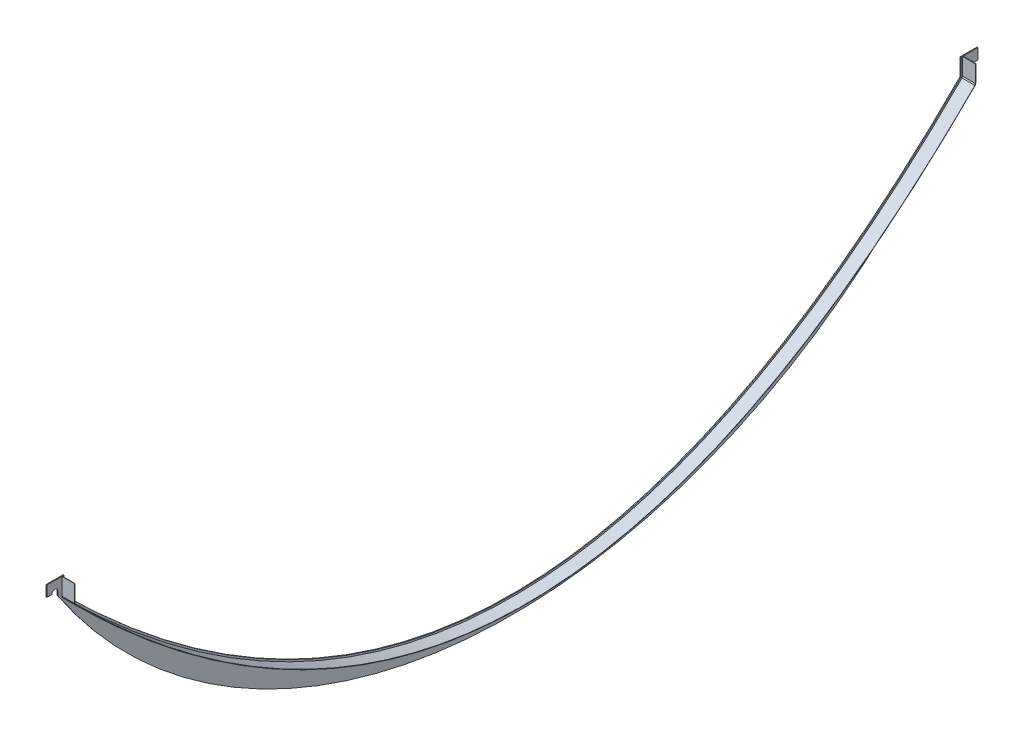
ISO-10303-21;
HEADER;
FILE_DESCRIPTION(('STEP AP214'),'2;1');
FILE_NAME('part.step','',(''),(''),'','','');
FILE_SCHEMA(('AUTOMOTIVE_DESIGN { 1 0 10303 214 1 1 1 1 }'));
ENDSEC;
DATA;
#1=APPLICATION_CONTEXT('core data for automotive mechanical design processes');
#2=APPLICATION_PROTOCOL_DEFINITION('international standard','automotive_design',2000,#1);
#3=PRODUCT_CONTEXT('',#1,'mechanical');
#4=PRODUCT('Part','Part','',(#3));
#5=PRODUCT_RELATED_PRODUCT_CATEGORY('part','',(#4));
#6=PRODUCT_DEFINITION_FORMATION('','',#4);
#7=PRODUCT_DEFINITION_CONTEXT('part definition',#1,'design');
#8=PRODUCT_DEFINITION('design','',#6,#7);
#9=PRODUCT_DEFINITION_SHAPE('','',#8);
#10=(LENGTH_UNIT() NAMED_UNIT(*) SI_UNIT(.MILLI.,.METRE.));
#11=(NAMED_UNIT(*) PLANE_ANGLE_UNIT() SI_UNIT($,.RADIAN.));
#12=(NAMED_UNIT(*) SI_UNIT($,.STERADIAN.) SOLID_ANGLE_UNIT());
#13=UNCERTAINTY_MEASURE_WITH_UNIT(LENGTH_MEASURE(1.E-05),#10,'distance_accuracy_value','');
#14=(GEOMETRIC_REPRESENTATION_CONTEXT(3) GLOBAL_UNCERTAINTY_ASSIGNED_CONTEXT((#13)) GLOBAL_UNIT_ASSIGNED_CONTEXT((#10,
#11,#12)) REPRESENTATION_CONTEXT('',''));
#15=CARTESIAN_POINT('',(0.,0.,0.));
#16=DIRECTION('',(0.,0.,1.));
#17=DIRECTION('',(1.,0.,0.));
#18=AXIS2_PLACEMENT_3D('',#15,#16,#17);
#19=CARTESIAN_POINT('',(2.54,-331.787529166974,-9.80548975348938E-10));
#20=DIRECTION('',(1.,0.,0.));
#21=DIRECTION('',(0.,0.,-1.));
#22=AXIS2_PLACEMENT_3D('',#19,#20,#21);
#23=PLANE('',#22);
#24=DIRECTION('',(0.,0.,1.));
#25=VECTOR('',#24,1.);
#26=CARTESIAN_POINT('',(2.54,382.587350832626,-1327.14999999998));
#27=LINE('',#26,#25);
#28=CARTESIAN_POINT('',(2.54,382.587350832626,-1377.95000240555));
#29=VERTEX_POINT('',#28);
#30=CARTESIAN_POINT('',(2.54,382.587350832626,-1333.49999999998));
#31=VERTEX_POINT('',#30);
#32=EDGE_CURVE('E162',#29,#31,#27,.T.);
#33=ORIENTED_EDGE('',*,*,#32,.T.);
#34=DIRECTION('',(0.,-1.,0.));
#35=VECTOR('',#34,1.);
#36=CARTESIAN_POINT('',(2.54,331.787470833133,-1333.49999999998));
#37=LINE('',#36,#35);
#38=CARTESIAN_POINT('',(2.54,331.787470833133,-1333.49999999998));
#39=VERTEX_POINT('',#38);
#40=EDGE_CURVE('E319',#31,#39,#37,.T.);
#41=ORIENTED_EDGE('',*,*,#40,.T.);
#42=DIRECTION('',(0.,-0.923879532475039,0.382683432452599));
#43=VECTOR('',#42,1.);
#44=CARTESIAN_POINT('',(2.54,327.297342772308,-1331.64012805989));
#45=LINE('',#44,#43);
#46=CARTESIAN_POINT('',(2.54,327.297342772308,-1331.64012805989));
#47=VERTEX_POINT('',#46);
#48=EDGE_CURVE('E316',#39,#47,#45,.T.);
#49=ORIENTED_EDGE('',*,*,#48,.T.);
#50=CARTESIAN_POINT('',(2.54000000000001,327.297342421288,1331.64012770984));
#51=CARTESIAN_POINT('',(2.54000000000001,216.514420462597,1220.8572057218));
#52=CARTESIAN_POINT('',(2.54000000000001,119.543483065854,1110.03926634494));
#53=CARTESIAN_POINT('',(2.54000000000001,-46.7566668610544,888.305733040598));
#54=CARTESIAN_POINT('',(2.54000000000001,-116.086154902246,777.389280230723));
#55=CARTESIAN_POINT('',(2.54000000000001,-227.060629021226,555.440331904742));
#56=CARTESIAN_POINT('',(2.54000000000001,-268.704746034081,444.40660332759));
#57=CARTESIAN_POINT('',(2.54000000000001,-324.244247161703,222.248598670373));
#58=CARTESIAN_POINT('',(2.54000000000001,-338.137529181646,111.124999809249));
#59=CARTESIAN_POINT('',(2.54000000000001,-338.137529152301,-111.125000161383));
#60=CARTESIAN_POINT('',(2.54000000000001,-324.244247103038,-222.248599022444));
#61=CARTESIAN_POINT('',(2.54000000000001,-268.704745916794,-444.406603679398));
#62=CARTESIAN_POINT('',(2.54000000000001,-227.06062887463,-555.440332256359));
#63=CARTESIAN_POINT('',(2.54000000000001,-116.086154697159,-777.389280581935));
#64=CARTESIAN_POINT('',(2.54000000000001,-46.7566666267703,-888.305733391594));
#65=CARTESIAN_POINT('',(2.54000000000001,119.54348335854,-1110.03926669548));
#66=CARTESIAN_POINT('',(2.54000000000001,216.514420784437,-1220.8572060721));
#67=CARTESIAN_POINT('',(2.54000000000001,327.29734277231,-1331.6401280599));
#68=B_SPLINE_CURVE_WITH_KNOTS('',3,(#50,#51,#52,#53,#54,#55,#56,#57,#58,#59,#60,#61,#62,#63,#64,
#65,#66,#67),.UNSPECIFIED.,.F.,.F.,(4,2,2,2,2,2,2,2,4),(0.,0.125,0.25,0.375,0.5,0.625,0.75,
0.875,1.),.UNSPECIFIED.);
#69=CARTESIAN_POINT('',(2.54,327.297342421288,1331.64012770984));
#70=VERTEX_POINT('',#69);
#71=EDGE_CURVE('E312',#47,#70,#68,.F.);
#72=ORIENTED_EDGE('',*,*,#71,.T.);
#73=DIRECTION('',(0.,0.923879517586631,0.382683468396395));
#74=VECTOR('',#73,1.);
#75=CARTESIAN_POINT('',(2.54,327.297342421288,1331.64012770984));
#76=LINE('',#75,#74);
#77=CARTESIAN_POINT('',(2.54,331.787470833133,1333.49999999998));
#78=VERTEX_POINT('',#77);
#79=EDGE_CURVE('E309',#70,#78,#76,.T.);
#80=ORIENTED_EDGE('',*,*,#79,.T.);
#81=DIRECTION('',(0.,1.,0.));
#82=VECTOR('',#81,1.);
#83=CARTESIAN_POINT('',(2.54,331.787470833133,1333.49999999998));
#84=LINE('',#83,#82);
#85=CARTESIAN_POINT('',(2.54,382.587350832634,1333.49999999998));
#86=VERTEX_POINT('',#85);
#87=EDGE_CURVE('E313',#78,#86,#84,.T.);
#88=ORIENTED_EDGE('',*,*,#87,.T.);
#89=DIRECTION('',(0.,-7.12465923009911E-13,1.));
#90=VECTOR('',#89,1.);
#91=CARTESIAN_POINT('',(2.54,382.587350832639,1327.15000000006));
#92=LINE('',#91,#90);
#93=CARTESIAN_POINT('',(2.54,382.587350832602,1377.95000240561));
#94=VERTEX_POINT('',#93);
#95=EDGE_CURVE('E192',#86,#94,#92,.T.);
#96=ORIENTED_EDGE('',*,*,#95,.T.);
#97=DIRECTION('',(0.,-1.,-7.04655444175812E-13));
#98=VECTOR('',#97,1.);
#99=CARTESIAN_POINT('',(2.54,382.587350832602,1377.95000240561));
#100=LINE('',#99,#98);
#101=CARTESIAN_POINT('',(2.54,350.761150832603,1377.95000240559));
#102=VERTEX_POINT('',#101);
#103=EDGE_CURVE('E264',#94,#102,#100,.T.);
#104=ORIENTED_EDGE('',*,*,#103,.T.);
#105=DIRECTION('',(0.,7.13625394007323E-13,-1.));
#106=VECTOR('',#105,1.);
#107=CARTESIAN_POINT('',(2.54,350.761150832603,1377.95000240559));
#108=LINE('',#107,#106);
#109=CARTESIAN_POINT('',(2.54,350.761150832613,1363.01479812907));
#110=VERTEX_POINT('',#109);
#111=EDGE_CURVE('E270',#102,#110,#108,.T.);
#112=ORIENTED_EDGE('',*,*,#111,.T.);
#113=CARTESIAN_POINT('',(2.54,350.761150832626,1354.04859906458));
#114=DIRECTION('',(-1.,0.,0.));
#115=DIRECTION('',(0.,0.,1.));
#116=AXIS2_PLACEMENT_3D('',#113,#114,#115);
#117=CIRCLE('',#116,8.96619906449081);
#118=CARTESIAN_POINT('',(2.54,350.761150832626,1345.0824000001));
#119=VERTEX_POINT('',#118);
#120=EDGE_CURVE('E272',#110,#119,#117,.T.);
#121=ORIENTED_EDGE('',*,*,#120,.T.);
#122=DIRECTION('',(0.,-1.,-7.26330521920819E-13));
#123=VECTOR('',#122,1.);
#124=CARTESIAN_POINT('',(2.54,350.761150832626,1345.0824000001));
#125=LINE('',#124,#123);
#126=CARTESIAN_POINT('',(2.54,338.838562794917,1345.08240000009));
#127=VERTEX_POINT('',#126);
#128=EDGE_CURVE('E274',#119,#127,#125,.T.);
#129=ORIENTED_EDGE('',*,*,#128,.T.);
#130=CARTESIAN_POINT('',(2.54,1232.06315709874,3.81723085261434E-10));
#131=DIRECTION('',(1.,0.,0.));
#132=DIRECTION('',(0.,0.,1.));
#133=AXIS2_PLACEMENT_3D('',#130,#131,#132);
#134=CIRCLE('',#133,1614.65068626568);
#135=CARTESIAN_POINT('',(2.54,338.838562795876,-1345.08239999997));
#136=VERTEX_POINT('',#135);
#137=EDGE_CURVE('E276',#127,#136,#134,.T.);
#138=ORIENTED_EDGE('',*,*,#137,.T.);
#139=DIRECTION('',(0.,1.,-6.61147013596444E-12));
#140=VECTOR('',#139,1.);
#141=CARTESIAN_POINT('',(2.54,350.761150832627,-1345.08240000004));
#142=LINE('',#141,#140);
#143=CARTESIAN_POINT('',(2.54,350.761150832627,-1345.08240000004));
#144=VERTEX_POINT('',#143);
#145=EDGE_CURVE('E278',#136,#144,#142,.T.);
#146=ORIENTED_EDGE('',*,*,#145,.T.);
#147=CARTESIAN_POINT('',(2.54,350.761150832627,-1354.04859906454));
#148=DIRECTION('',(-1.,0.,0.));
#149=DIRECTION('',(0.,0.,-1.));
#150=AXIS2_PLACEMENT_3D('',#147,#148,#149);
#151=CIRCLE('',#150,8.96619906449081);
#152=CARTESIAN_POINT('',(2.54,350.761150832627,-1363.01479812903));
#153=VERTEX_POINT('',#152);
#154=EDGE_CURVE('E280',#144,#153,#151,.T.);
#155=ORIENTED_EDGE('',*,*,#154,.T.);
#156=DIRECTION('',(0.,0.,-1.));
#157=VECTOR('',#156,1.);
#158=CARTESIAN_POINT('',(2.54,350.761150832627,-1377.95000240555));
#159=LINE('',#158,#157);
#160=CARTESIAN_POINT('',(2.54,350.761150832627,-1377.95000240555));
#161=VERTEX_POINT('',#160);
#162=EDGE_CURVE('E164',#153,#161,#159,.T.);
#163=ORIENTED_EDGE('',*,*,#162,.T.);
#164=DIRECTION('',(0.,1.,0.));
#165=VECTOR('',#164,1.);
#166=CARTESIAN_POINT('',(2.54,382.587350832626,-1377.95000240555));
#167=LINE('',#166,#165);
#168=EDGE_CURVE('E157',#161,#29,#167,.T.);
#169=ORIENTED_EDGE('',*,*,#168,.T.);
#170=EDGE_LOOP('',(#33,#41,#49,#72,#80,#88,#96,#104,#112,#121,#129,#138,#146,#155,#163,#169));
#171=FACE_BOUND('',#170,.T.);
#172=ADVANCED_FACE('F35',(#171),#23,.T.);
#173=CARTESIAN_POINT('',(2.54,999668.212470872,-51519.8990674703));
#174=CARTESIAN_POINT('',(2.54,-1000331.78752917,-7.55456142087496E-07));
#175=CARTESIAN_POINT('',(2.54,999668.212470794,51519.8990689773));
#176=B_SPLINE_CURVE_WITH_KNOTS('',2,(#173,#174,#175),.UNSPECIFIED.,.F.,.F.,(3,3),(0.,1.),.UNSPECIFIED.);
#177=DIRECTION('',(-1.,0.,0.));
#178=VECTOR('',#177,1.);
#179=SURFACE_OF_LINEAR_EXTRUSION('',#176,#178);
#180=CARTESIAN_POINT('',(0.,999668.212470872,-51519.8990674703));
#181=CARTESIAN_POINT('',(0.,-1000331.78752917,-7.55456142087496E-07));
#182=CARTESIAN_POINT('',(0.,999668.212470794,51519.8990689773));
#183=B_SPLINE_CURVE_WITH_KNOTS('',2,(#180,#181,#182),.UNSPECIFIED.,.F.,.F.,(3,3),(0.,1.),.UNSPECIFIED.);
#184=CARTESIAN_POINT('',(0.,331.787470833288,-1327.14999999977));
#185=VERTEX_POINT('',#184);
#186=CARTESIAN_POINT('',(0.,331.787470832646,1327.15000000013));
#187=VERTEX_POINT('',#186);
#188=EDGE_CURVE('E200',#185,#187,#183,.T.);
#189=ORIENTED_EDGE('',*,*,#188,.T.);
#190=DIRECTION('',(-1.,0.,0.));
#191=VECTOR('',#190,1.);
#192=CARTESIAN_POINT('',(2.54,331.787470832646,1327.15000000013));
#193=LINE('',#192,#191);
#194=CARTESIAN_POINT('',(2.54,331.787470832646,1327.15000000013));
#195=VERTEX_POINT('',#194);
#196=EDGE_CURVE('E11',#195,#187,#193,.T.);
#197=ORIENTED_EDGE('',*,*,#196,.F.);
#198=CARTESIAN_POINT('',(2.54,331.787470833288,-1327.14999999977));
#199=VERTEX_POINT('',#198);
#200=EDGE_CURVE('E233',#199,#195,#176,.T.);
#201=ORIENTED_EDGE('',*,*,#200,.F.);
#202=DIRECTION('',(-1.,0.,0.));
#203=VECTOR('',#202,1.);
#204=CARTESIAN_POINT('',(2.54,331.787470833288,-1327.14999999977));
#205=LINE('',#204,#203);
#206=EDGE_CURVE('E187',#199,#185,#205,.T.);
#207=ORIENTED_EDGE('',*,*,#206,.T.);
#208=EDGE_LOOP('',(#189,#197,#201,#207));
#209=FACE_BOUND('',#208,.T.);
#210=ADVANCED_FACE('F37',(#209),#179,.F.);
#211=CARTESIAN_POINT('',(2.54,331.787470832646,1327.15000000013));
#212=DIRECTION('',(0.,1.49487075332406E-12,1.));
#213=DIRECTION('',(0.,-1.,1.49487075332406E-12));
#214=AXIS2_PLACEMENT_3D('',#211,#212,#213);
#215=PLANE('',#214);
#216=DIRECTION('',(0.,1.,-1.49487075332406E-12));
#217=VECTOR('',#216,1.);
#218=CARTESIAN_POINT('',(0.,331.787470832646,1327.15000000013));
#219=LINE('',#218,#217);
#220=CARTESIAN_POINT('',(0.,382.587350832639,1327.15000000006));
#221=VERTEX_POINT('',#220);
#222=EDGE_CURVE('E205',#187,#221,#219,.T.);
#223=ORIENTED_EDGE('',*,*,#222,.T.);
#224=DIRECTION('',(-1.,0.,0.));
#225=VECTOR('',#224,1.);
#226=CARTESIAN_POINT('',(2.54,382.587350832639,1327.15000000006));
#227=LINE('',#226,#225);
#228=CARTESIAN_POINT('',(2.54,382.587350832639,1327.15000000006));
#229=VERTEX_POINT('',#228);
#230=EDGE_CURVE('E45',#229,#221,#227,.T.);
#231=ORIENTED_EDGE('',*,*,#230,.F.);
#232=DIRECTION('',(0.,1.,-1.49487075332406E-12));
#233=VECTOR('',#232,1.);
#234=CARTESIAN_POINT('',(2.54,331.787470832646,1327.15000000013));
#235=LINE('',#234,#233);
#236=EDGE_CURVE('E121',#195,#229,#235,.T.);
#237=ORIENTED_EDGE('',*,*,#236,.F.);
#238=ORIENTED_EDGE('',*,*,#196,.T.);
#239=EDGE_LOOP('',(#223,#231,#237,#238));
#240=FACE_BOUND('',#239,.T.);
#241=ADVANCED_FACE('F638',(#240),#215,.F.);
#242=CARTESIAN_POINT('',(2.54,382.587350832639,1327.15000000006));
#243=DIRECTION('',(0.,-1.,-7.12465923009911E-13));
#244=DIRECTION('',(0.,7.12465923009911E-13,-1.));
#245=AXIS2_PLACEMENT_3D('',#242,#243,#244);
#246=PLANE('',#245);
#247=DIRECTION('',(0.,-7.12465923009911E-13,1.));
#248=VECTOR('',#247,1.);
#249=CARTESIAN_POINT('',(0.,382.587350832639,1327.15000000006));
#250=LINE('',#249,#248);
#251=CARTESIAN_POINT('',(0.,382.587350832602,1377.95000240561));
#252=VERTEX_POINT('',#251);
#253=EDGE_CURVE('E211',#221,#252,#250,.T.);
#254=ORIENTED_EDGE('',*,*,#253,.T.);
#255=DIRECTION('',(-1.,0.,0.));
#256=VECTOR('',#255,1.);
#257=CARTESIAN_POINT('',(2.54,382.587350832602,1377.95000240561));
#258=LINE('',#257,#256);
#259=EDGE_CURVE('E258',#94,#252,#258,.T.);
#260=ORIENTED_EDGE('',*,*,#259,.F.);
#261=ORIENTED_EDGE('',*,*,#95,.F.);
#262=DIRECTION('',(-1.,0.,0.));
#263=VECTOR('',#262,1.);
#264=CARTESIAN_POINT('',(40.64,382.587350832626,1333.49999999998));
#265=LINE('',#264,#263);
#266=CARTESIAN_POINT('',(40.64,382.587350832626,1333.49999999998));
#267=VERTEX_POINT('',#266);
#268=EDGE_CURVE('E53',#267,#86,#265,.T.);
#269=ORIENTED_EDGE('',*,*,#268,.F.);
#270=DIRECTION('',(0.,0.,-1.));
#271=VECTOR('',#270,1.);
#272=CARTESIAN_POINT('',(40.64,382.587350832626,1333.49999999998));
#273=LINE('',#272,#271);
#274=CARTESIAN_POINT('',(40.64,382.587350832626,1332.22999999998));
#275=VERTEX_POINT('',#274);
#276=EDGE_CURVE('E530',#267,#275,#273,.T.);
#277=ORIENTED_EDGE('',*,*,#276,.T.);
#278=DIRECTION('',(-1.,0.,0.));
#279=VECTOR('',#278,1.);
#280=CARTESIAN_POINT('',(40.64,382.587350832626,1332.22999999998));
#281=LINE('',#280,#279);
#282=CARTESIAN_POINT('',(2.54,382.587350832626,1332.22999999998));
#283=VERTEX_POINT('',#282);
#284=EDGE_CURVE('E206',#275,#283,#281,.T.);
#285=ORIENTED_EDGE('',*,*,#284,.T.);
#286=EDGE_CURVE('E262',#229,#283,#92,.T.);
#287=ORIENTED_EDGE('',*,*,#286,.F.);
#288=ORIENTED_EDGE('',*,*,#230,.T.);
#289=EDGE_LOOP('',(#254,#260,#261,#269,#277,#285,#287,#288));
#290=FACE_BOUND('',#289,.T.);
#291=ADVANCED_FACE('F607',(#290),#246,.F.);
#292=CARTESIAN_POINT('',(2.54,382.587350832602,1377.95000240561));
#293=DIRECTION('',(0.,7.04655444175812E-13,-1.));
#294=DIRECTION('',(0.,1.,7.04655444175812E-13));
#295=AXIS2_PLACEMENT_3D('',#292,#293,#294);
#296=PLANE('',#295);
#297=DIRECTION('',(0.,-1.,-7.04655444175812E-13));
#298=VECTOR('',#297,1.);
#299=CARTESIAN_POINT('',(0.,382.587350832602,1377.95000240561));
#300=LINE('',#299,#298);
#301=CARTESIAN_POINT('',(0.,350.761150832603,1377.95000240559));
#302=VERTEX_POINT('',#301);
#303=EDGE_CURVE('E213',#252,#302,#300,.T.);
#304=ORIENTED_EDGE('',*,*,#303,.T.);
#305=DIRECTION('',(-1.,0.,0.));
#306=VECTOR('',#305,1.);
#307=CARTESIAN_POINT('',(2.54,350.761150832603,1377.95000240559));
#308=LINE('',#307,#306);
#309=EDGE_CURVE('E255',#102,#302,#308,.T.);
#310=ORIENTED_EDGE('',*,*,#309,.F.);
#311=ORIENTED_EDGE('',*,*,#103,.F.);
#312=ORIENTED_EDGE('',*,*,#259,.T.);
#313=EDGE_LOOP('',(#304,#310,#311,#312));
#314=FACE_BOUND('',#313,.T.);
#315=ADVANCED_FACE('F614',(#314),#296,.F.);
#316=CARTESIAN_POINT('',(2.54,350.761150832603,1377.95000240559));
#317=DIRECTION('',(0.,1.,7.13625394007323E-13));
#318=DIRECTION('',(0.,-7.13625394007323E-13,1.));
#319=AXIS2_PLACEMENT_3D('',#316,#317,#318);
#320=PLANE('',#319);
#321=DIRECTION('',(0.,7.13625394007323E-13,-1.));
#322=VECTOR('',#321,1.);
#323=CARTESIAN_POINT('',(0.,350.761150832603,1377.95000240559));
#324=LINE('',#323,#322);
#325=CARTESIAN_POINT('',(0.,350.761150832613,1363.01479812907));
#326=VERTEX_POINT('',#325);
#327=EDGE_CURVE('E215',#302,#326,#324,.T.);
#328=ORIENTED_EDGE('',*,*,#327,.T.);
#329=DIRECTION('',(-1.,0.,0.));
#330=VECTOR('',#329,1.);
#331=CARTESIAN_POINT('',(2.54,350.761150832613,1363.01479812907));
#332=LINE('',#331,#330);
#333=EDGE_CURVE('E252',#110,#326,#332,.T.);
#334=ORIENTED_EDGE('',*,*,#333,.F.);
#335=ORIENTED_EDGE('',*,*,#111,.F.);
#336=ORIENTED_EDGE('',*,*,#309,.T.);
#337=EDGE_LOOP('',(#328,#334,#335,#336));
#338=FACE_BOUND('',#337,.T.);
#339=ADVANCED_FACE('F618',(#338),#320,.F.);
#340=CARTESIAN_POINT('',(2.54,350.761150832626,1354.04859906458));
#341=DIRECTION('',(-1.,0.,0.));
#342=DIRECTION('',(0.,0.,1.));
#343=AXIS2_PLACEMENT_3D('',#340,#341,#342);
#344=CYLINDRICAL_SURFACE('',#343,8.96619906449081);
#345=CARTESIAN_POINT('',(0.,350.761150832626,1354.04859906458));
#346=DIRECTION('',(-1.,0.,0.));
#347=DIRECTION('',(0.,0.,1.));
#348=AXIS2_PLACEMENT_3D('',#345,#346,#347);
#349=CIRCLE('',#348,8.96619906449081);
#350=CARTESIAN_POINT('',(0.,350.761150832626,1345.0824000001));
#351=VERTEX_POINT('',#350);
#352=EDGE_CURVE('E217',#326,#351,#349,.T.);
#353=ORIENTED_EDGE('',*,*,#352,.T.);
#354=DIRECTION('',(-1.,0.,0.));
#355=VECTOR('',#354,1.);
#356=CARTESIAN_POINT('',(2.54,350.761150832626,1345.0824000001));
#357=LINE('',#356,#355);
#358=EDGE_CURVE('E249',#119,#351,#357,.T.);
#359=ORIENTED_EDGE('',*,*,#358,.F.);
#360=ORIENTED_EDGE('',*,*,#120,.F.);
#361=ORIENTED_EDGE('',*,*,#333,.T.);
#362=EDGE_LOOP('',(#353,#359,#360,#361));
#363=FACE_BOUND('',#362,.T.);
#364=ADVANCED_FACE('F623',(#363),#344,.F.);
#365=CARTESIAN_POINT('',(2.54,350.761150832626,1345.0824000001));
#366=DIRECTION('',(0.,7.26330521920819E-13,-1.));
#367=DIRECTION('',(0.,1.,7.26330521920819E-13));
#368=AXIS2_PLACEMENT_3D('',#365,#366,#367);
#369=PLANE('',#368);
#370=DIRECTION('',(0.,-1.,-7.26330521920819E-13));
#371=VECTOR('',#370,1.);
#372=CARTESIAN_POINT('',(0.,350.761150832626,1345.0824000001));
#373=LINE('',#372,#371);
#374=CARTESIAN_POINT('',(0.,338.838562794917,1345.08240000009));
#375=VERTEX_POINT('',#374);
#376=EDGE_CURVE('E219',#351,#375,#373,.T.);
#377=ORIENTED_EDGE('',*,*,#376,.T.);
#378=DIRECTION('',(-1.,0.,0.));
#379=VECTOR('',#378,1.);
#380=CARTESIAN_POINT('',(2.54,338.838562794917,1345.08240000009));
#381=LINE('',#380,#379);
#382=EDGE_CURVE('E246',#127,#375,#381,.T.);
#383=ORIENTED_EDGE('',*,*,#382,.F.);
#384=ORIENTED_EDGE('',*,*,#128,.F.);
#385=ORIENTED_EDGE('',*,*,#358,.T.);
#386=EDGE_LOOP('',(#377,#383,#384,#385));
#387=FACE_BOUND('',#386,.T.);
#388=ADVANCED_FACE('F629',(#387),#369,.F.);
#389=CARTESIAN_POINT('',(2.54,1232.06315709874,3.81723085261434E-10));
#390=DIRECTION('',(-1.,0.,0.));
#391=DIRECTION('',(0.,0.,1.));
#392=AXIS2_PLACEMENT_3D('',#389,#390,#391);
#393=CYLINDRICAL_SURFACE('',#392,1614.65068626568);
#394=CARTESIAN_POINT('',(0.,1232.06315709874,3.81723085261434E-10));
#395=DIRECTION('',(1.,0.,0.));
#396=DIRECTION('',(0.,0.,1.));
#397=AXIS2_PLACEMENT_3D('',#394,#395,#396);
#398=CIRCLE('',#397,1614.65068626568);
#399=CARTESIAN_POINT('',(0.,338.838562795876,-1345.08239999997));
#400=VERTEX_POINT('',#399);
#401=EDGE_CURVE('E221',#375,#400,#398,.T.);
#402=ORIENTED_EDGE('',*,*,#401,.T.);
#403=DIRECTION('',(-1.,0.,0.));
#404=VECTOR('',#403,1.);
#405=CARTESIAN_POINT('',(2.54,338.838562795876,-1345.08239999997));
#406=LINE('',#405,#404);
#407=EDGE_CURVE('E243',#136,#400,#406,.T.);
#408=ORIENTED_EDGE('',*,*,#407,.F.);
#409=ORIENTED_EDGE('',*,*,#137,.F.);
#410=ORIENTED_EDGE('',*,*,#382,.T.);
#411=EDGE_LOOP('',(#402,#408,#409,#410));
#412=FACE_BOUND('',#411,.T.);
#413=ADVANCED_FACE('F633',(#412),#393,.T.);
#414=CARTESIAN_POINT('',(2.54,350.761150832627,-1345.08240000004));
#415=DIRECTION('',(0.,6.61147013596444E-12,1.));
#416=DIRECTION('',(0.,-1.,6.61147013596444E-12));
#417=AXIS2_PLACEMENT_3D('',#414,#415,#416);
#418=PLANE('',#417);
#419=DIRECTION('',(0.,1.,-6.61147013596444E-12));
#420=VECTOR('',#419,1.);
#421=CARTESIAN_POINT('',(0.,350.761150832627,-1345.08240000004));
#422=LINE('',#421,#420);
#423=CARTESIAN_POINT('',(0.,350.761150832627,-1345.08240000004));
#424=VERTEX_POINT('',#423);
#425=EDGE_CURVE('E223',#400,#424,#422,.T.);
#426=ORIENTED_EDGE('',*,*,#425,.T.);
#427=DIRECTION('',(-1.,0.,0.));
#428=VECTOR('',#427,1.);
#429=CARTESIAN_POINT('',(2.54,350.761150832627,-1345.08240000004));
#430=LINE('',#429,#428);
#431=EDGE_CURVE('E240',#144,#424,#430,.T.);
#432=ORIENTED_EDGE('',*,*,#431,.F.);
#433=ORIENTED_EDGE('',*,*,#145,.F.);
#434=ORIENTED_EDGE('',*,*,#407,.T.);
#435=EDGE_LOOP('',(#426,#432,#433,#434));
#436=FACE_BOUND('',#435,.T.);
#437=ADVANCED_FACE('F636',(#436),#418,.F.);
#438=CARTESIAN_POINT('',(2.54,350.761150832627,-1354.04859906454));
#439=DIRECTION('',(-1.,0.,0.));
#440=DIRECTION('',(0.,0.,1.));
#441=AXIS2_PLACEMENT_3D('',#438,#439,#440);
#442=CYLINDRICAL_SURFACE('',#441,8.96619906449081);
#443=CARTESIAN_POINT('',(0.,350.761150832627,-1354.04859906454));
#444=DIRECTION('',(-1.,0.,0.));
#445=DIRECTION('',(0.,0.,-1.));
#446=AXIS2_PLACEMENT_3D('',#443,#444,#445);
#447=CIRCLE('',#446,8.96619906449081);
#448=CARTESIAN_POINT('',(0.,350.761150832627,-1363.01479812903));
#449=VERTEX_POINT('',#448);
#450=EDGE_CURVE('E225',#424,#449,#447,.T.);
#451=ORIENTED_EDGE('',*,*,#450,.T.);
#452=DIRECTION('',(-1.,0.,0.));
#453=VECTOR('',#452,1.);
#454=CARTESIAN_POINT('',(2.54,350.761150832627,-1363.01479812903));
#455=LINE('',#454,#453);
#456=EDGE_CURVE('E237',#153,#449,#455,.T.);
#457=ORIENTED_EDGE('',*,*,#456,.F.);
#458=ORIENTED_EDGE('',*,*,#154,.F.);
#459=ORIENTED_EDGE('',*,*,#431,.T.);
#460=EDGE_LOOP('',(#451,#457,#458,#459));
#461=FACE_BOUND('',#460,.T.);
#462=ADVANCED_FACE('F286',(#461),#442,.F.);
#463=CARTESIAN_POINT('',(2.54,350.761150832627,-1377.95000240555));
#464=DIRECTION('',(0.,1.,0.));
#465=DIRECTION('',(0.,0.,1.));
#466=AXIS2_PLACEMENT_3D('',#463,#464,#465);
#467=PLANE('',#466);
#468=DIRECTION('',(0.,0.,-1.));
#469=VECTOR('',#468,1.);
#470=CARTESIAN_POINT('',(0.,350.761150832627,-1377.95000240555));
#471=LINE('',#470,#469);
#472=CARTESIAN_POINT('',(0.,350.761150832627,-1377.95000240555));
#473=VERTEX_POINT('',#472);
#474=EDGE_CURVE('E227',#449,#473,#471,.T.);
#475=ORIENTED_EDGE('',*,*,#474,.T.);
#476=DIRECTION('',(-1.,0.,0.));
#477=VECTOR('',#476,1.);
#478=CARTESIAN_POINT('',(2.54,350.761150832627,-1377.95000240555));
#479=LINE('',#478,#477);
#480=EDGE_CURVE('E177',#161,#473,#479,.T.);
#481=ORIENTED_EDGE('',*,*,#480,.F.);
#482=ORIENTED_EDGE('',*,*,#162,.F.);
#483=ORIENTED_EDGE('',*,*,#456,.T.);
#484=EDGE_LOOP('',(#475,#481,#482,#483));
#485=FACE_BOUND('',#484,.T.);
#486=ADVANCED_FACE('F290',(#485),#467,.F.);
#487=CARTESIAN_POINT('',(2.54,382.587350832626,-1377.95000240555));
#488=DIRECTION('',(0.,0.,1.));
#489=DIRECTION('',(1.,0.,0.));
#490=AXIS2_PLACEMENT_3D('',#487,#488,#489);
#491=PLANE('',#490);
#492=DIRECTION('',(0.,1.,0.));
#493=VECTOR('',#492,1.);
#494=CARTESIAN_POINT('',(0.,382.587350832626,-1377.95000240555));
#495=LINE('',#494,#493);
#496=CARTESIAN_POINT('',(0.,382.587350832626,-1377.95000240555));
#497=VERTEX_POINT('',#496);
#498=EDGE_CURVE('E174',#473,#497,#495,.T.);
#499=ORIENTED_EDGE('',*,*,#498,.T.);
#500=DIRECTION('',(-1.,0.,0.));
#501=VECTOR('',#500,1.);
#502=CARTESIAN_POINT('',(2.54,382.587350832626,-1377.95000240555));
#503=LINE('',#502,#501);
#504=EDGE_CURVE('E171',#29,#497,#503,.T.);
#505=ORIENTED_EDGE('',*,*,#504,.F.);
#506=ORIENTED_EDGE('',*,*,#168,.F.);
#507=ORIENTED_EDGE('',*,*,#480,.T.);
#508=EDGE_LOOP('',(#499,#505,#506,#507));
#509=FACE_BOUND('',#508,.T.);
#510=ADVANCED_FACE('F172',(#509),#491,.F.);
#511=CARTESIAN_POINT('',(2.54,382.587350832626,-1327.14999999998));
#512=DIRECTION('',(0.,-1.,0.));
#513=DIRECTION('',(0.,0.,-1.));
#514=AXIS2_PLACEMENT_3D('',#511,#512,#513);
#515=PLANE('',#514);
#516=DIRECTION('',(0.,0.,1.));
#517=VECTOR('',#516,1.);
#518=CARTESIAN_POINT('',(0.,382.587350832626,-1327.14999999998));
#519=LINE('',#518,#517);
#520=CARTESIAN_POINT('',(0.,382.587350832626,-1327.14999999998));
#521=VERTEX_POINT('',#520);
#522=EDGE_CURVE('E230',#497,#521,#519,.T.);
#523=ORIENTED_EDGE('',*,*,#522,.T.);
#524=DIRECTION('',(-1.,0.,0.));
#525=VECTOR('',#524,1.);
#526=CARTESIAN_POINT('',(2.54,382.587350832626,-1327.14999999998));
#527=LINE('',#526,#525);
#528=CARTESIAN_POINT('',(2.54,382.587350832626,-1327.14999999998));
#529=VERTEX_POINT('',#528);
#530=EDGE_CURVE('E178',#529,#521,#527,.T.);
#531=ORIENTED_EDGE('',*,*,#530,.F.);
#532=CARTESIAN_POINT('',(2.54,382.587350832626,-1332.22999999998));
#533=VERTEX_POINT('',#532);
#534=EDGE_CURVE('E168',#533,#529,#27,.T.);
#535=ORIENTED_EDGE('',*,*,#534,.F.);
#536=DIRECTION('',(-1.,0.,0.));
#537=VECTOR('',#536,1.);
#538=CARTESIAN_POINT('',(40.64,382.587350832626,-1332.22999999998));
#539=LINE('',#538,#537);
#540=CARTESIAN_POINT('',(40.64,382.587350832626,-1332.22999999998));
#541=VERTEX_POINT('',#540);
#542=EDGE_CURVE('E505',#541,#533,#539,.T.);
#543=ORIENTED_EDGE('',*,*,#542,.F.);
#544=DIRECTION('',(0.,0.,-1.));
#545=VECTOR('',#544,1.);
#546=CARTESIAN_POINT('',(40.64,382.587350832626,-1332.22999999998));
#547=LINE('',#546,#545);
#548=CARTESIAN_POINT('',(40.64,382.587350832626,-1333.49999999998));
#549=VERTEX_POINT('',#548);
#550=EDGE_CURVE('E357',#541,#549,#547,.T.);
#551=ORIENTED_EDGE('',*,*,#550,.T.);
#552=DIRECTION('',(-1.,0.,0.));
#553=VECTOR('',#552,1.);
#554=CARTESIAN_POINT('',(40.64,382.587350832626,-1333.49999999998));
#555=LINE('',#554,#553);
#556=EDGE_CURVE('E184',#549,#31,#555,.T.);
#557=ORIENTED_EDGE('',*,*,#556,.T.);
#558=ORIENTED_EDGE('',*,*,#32,.F.);
#559=ORIENTED_EDGE('',*,*,#504,.T.);
#560=EDGE_LOOP('',(#523,#531,#535,#543,#551,#557,#558,#559));
#561=FACE_BOUND('',#560,.T.);
#562=ADVANCED_FACE('F181',(#561),#515,.F.);
#563=CARTESIAN_POINT('',(2.54,331.787470833288,-1327.14999999977));
#564=DIRECTION('',(0.,-4.15678972640199E-12,-1.));
#565=DIRECTION('',(0.,1.,-4.15678972640199E-12));
#566=AXIS2_PLACEMENT_3D('',#563,#564,#565);
#567=PLANE('',#566);
#568=DIRECTION('',(0.,-1.,4.15678972640199E-12));
#569=VECTOR('',#568,1.);
#570=CARTESIAN_POINT('',(0.,331.787470833288,-1327.14999999977));
#571=LINE('',#570,#569);
#572=EDGE_CURVE('E113',#521,#185,#571,.T.);
#573=ORIENTED_EDGE('',*,*,#572,.T.);
#574=ORIENTED_EDGE('',*,*,#206,.F.);
#575=DIRECTION('',(0.,-1.,4.15678972640199E-12));
#576=VECTOR('',#575,1.);
#577=CARTESIAN_POINT('',(2.54,331.787470833288,-1327.14999999977));
#578=LINE('',#577,#576);
#579=EDGE_CURVE('E62',#529,#199,#578,.T.);
#580=ORIENTED_EDGE('',*,*,#579,.F.);
#581=ORIENTED_EDGE('',*,*,#530,.T.);
#582=EDGE_LOOP('',(#573,#574,#580,#581));
#583=FACE_BOUND('',#582,.T.);
#584=ADVANCED_FACE('F296',(#583),#567,.F.);
#585=DIRECTION('',(0.,1.,0.));
#586=VECTOR('',#585,1.);
#587=CARTESIAN_POINT('',(2.54,331.787470833133,1332.22999999998));
#588=LINE('',#587,#586);
#589=CARTESIAN_POINT('',(2.54,332.04008956545,1332.22999999998));
#590=VERTEX_POINT('',#589);
#591=EDGE_CURVE('E544',#590,#283,#588,.T.);
#592=ORIENTED_EDGE('',*,*,#591,.F.);
#593=DIRECTION('',(0.,0.923879517586631,0.382683468396395));
#594=VECTOR('',#593,1.);
#595=CARTESIAN_POINT('',(2.54,327.783350426152,1330.4668007225));
#596=LINE('',#595,#594);
#597=CARTESIAN_POINT('',(2.54,328.016760141868,1330.563482203));
#598=VERTEX_POINT('',#597);
#599=EDGE_CURVE('E409',#598,#590,#596,.T.);
#600=ORIENTED_EDGE('',*,*,#599,.F.);
#601=CARTESIAN_POINT('',(2.54000000000001,328.01676047465,-1330.56348253487));
#602=CARTESIAN_POINT('',(2.54000000000001,217.300990844194,-1219.8328308367));
#603=CARTESIAN_POINT('',(2.54000000000001,120.396002040381,-1109.0741740749));
#604=CARTESIAN_POINT('',(2.54000000000001,-45.7782409118726,-887.478733858387));
#605=CARTESIAN_POINT('',(2.54000000000001,-115.047704784795,-776.641272658879));
#606=CARTESIAN_POINT('',(2.54000000000001,-225.916661245221,-554.87355057881));
#607=CARTESIAN_POINT('',(2.54000000000001,-267.515471252475,-443.942272951587));
#608=CARTESIAN_POINT('',(2.54000000000001,-322.991733553584,-222.007388300337));
#609=CARTESIAN_POINT('',(2.54000000000001,-336.867529153072,-111.004224805614));
#610=CARTESIAN_POINT('',(2.54000000000001,-336.867529180875,111.004224471936));
#611=CARTESIAN_POINT('',(2.54000000000001,-322.991733609167,222.007387966709));
#612=CARTESIAN_POINT('',(2.54000000000001,-267.515471363612,443.942272618178));
#613=CARTESIAN_POINT('',(2.54000000000001,-225.916661384142,554.873550245565));
#614=CARTESIAN_POINT('',(2.54000000000001,-115.047704979172,776.641272325979));
#615=CARTESIAN_POINT('',(2.54000000000001,-45.7782411339354,887.478733525675));
#616=CARTESIAN_POINT('',(2.54000000000001,120.396001762931,1109.0741737426));
#617=CARTESIAN_POINT('',(2.54000000000001,217.300990539091,1219.83283050462));
#618=CARTESIAN_POINT('',(2.54000000000001,328.016760141869,1330.563482203));
#619=B_SPLINE_CURVE_WITH_KNOTS('',3,(#601,#602,#603,#604,#605,#606,#607,#608,#609,#610,#611,
#612,#613,#614,#615,#616,#617,#618),.UNSPECIFIED.,.F.,.F.,(4,2,2,2,2,2,2,2,4),(0.,0.125,0.25,
0.375,0.5,0.625,0.75,0.875,1.),.UNSPECIFIED.);
#620=CARTESIAN_POINT('',(2.54,328.01676047465,-1330.56348253487));
#621=VERTEX_POINT('',#620);
#622=EDGE_CURVE('E405',#621,#598,#619,.T.);
#623=ORIENTED_EDGE('',*,*,#622,.F.);
#624=DIRECTION('',(0.,-0.923879532475039,0.382683432452599));
#625=VECTOR('',#624,1.);
#626=CARTESIAN_POINT('',(2.54,327.783350731523,-1330.46680105365));
#627=LINE('',#626,#625);
#628=CARTESIAN_POINT('',(2.54,332.040089539768,-1332.22999999998));
#629=VERTEX_POINT('',#628);
#630=EDGE_CURVE('E397',#629,#621,#627,.T.);
#631=ORIENTED_EDGE('',*,*,#630,.F.);
#632=DIRECTION('',(0.,1.,0.));
#633=VECTOR('',#632,1.);
#634=CARTESIAN_POINT('',(2.54,331.787470833133,-1332.22999999998));
#635=LINE('',#634,#633);
#636=EDGE_CURVE('E406',#533,#629,#635,.F.);
#637=ORIENTED_EDGE('',*,*,#636,.F.);
#638=ORIENTED_EDGE('',*,*,#534,.T.);
#639=ORIENTED_EDGE('',*,*,#579,.T.);
#640=ORIENTED_EDGE('',*,*,#200,.T.);
#641=ORIENTED_EDGE('',*,*,#236,.T.);
#642=ORIENTED_EDGE('',*,*,#286,.T.);
#643=EDGE_LOOP('',(#592,#600,#623,#631,#637,#638,#639,#640,#641,#642));
#644=FACE_BOUND('',#643,.T.);
#645=ADVANCED_FACE('F582',(#644),#23,.T.);
#646=CARTESIAN_POINT('',(0.,-331.787529166974,-9.80548975348938E-10));
#647=DIRECTION('',(1.,0.,0.));
#648=DIRECTION('',(0.,0.,-1.));
#649=AXIS2_PLACEMENT_3D('',#646,#647,#648);
#650=PLANE('',#649);
#651=ORIENTED_EDGE('',*,*,#188,.F.);
#652=ORIENTED_EDGE('',*,*,#572,.F.);
#653=ORIENTED_EDGE('',*,*,#522,.F.);
#654=ORIENTED_EDGE('',*,*,#498,.F.);
#655=ORIENTED_EDGE('',*,*,#474,.F.);
#656=ORIENTED_EDGE('',*,*,#450,.F.);
#657=ORIENTED_EDGE('',*,*,#425,.F.);
#658=ORIENTED_EDGE('',*,*,#401,.F.);
#659=ORIENTED_EDGE('',*,*,#376,.F.);
#660=ORIENTED_EDGE('',*,*,#352,.F.);
#661=ORIENTED_EDGE('',*,*,#327,.F.);
#662=ORIENTED_EDGE('',*,*,#303,.F.);
#663=ORIENTED_EDGE('',*,*,#253,.F.);
#664=ORIENTED_EDGE('',*,*,#222,.F.);
#665=EDGE_LOOP('',(#651,#652,#653,#654,#655,#656,#657,#658,#659,#660,#661,#662,#663,#664));
#666=FACE_BOUND('',#665,.T.);
#667=ADVANCED_FACE('F293',(#666),#650,.F.);
#668=CARTESIAN_POINT('',(40.64,331.787470833133,1332.22999999998));
#669=DIRECTION('',(0.,0.,1.));
#670=DIRECTION('',(1.,0.,0.));
#671=AXIS2_PLACEMENT_3D('',#668,#669,#670);
#672=PLANE('',#671);
#673=ORIENTED_EDGE('',*,*,#591,.T.);
#674=ORIENTED_EDGE('',*,*,#284,.F.);
#675=DIRECTION('',(0.,1.,0.));
#676=VECTOR('',#675,1.);
#677=CARTESIAN_POINT('',(40.64,331.787470833133,1332.22999999998));
#678=LINE('',#677,#676);
#679=CARTESIAN_POINT('',(40.64,332.04008956545,1332.22999999998));
#680=VERTEX_POINT('',#679);
#681=EDGE_CURVE('E412',#680,#275,#678,.T.);
#682=ORIENTED_EDGE('',*,*,#681,.F.);
#683=DIRECTION('',(-1.,0.,0.));
#684=VECTOR('',#683,1.);
#685=CARTESIAN_POINT('',(40.64,332.04008956545,1332.22999999998));
#686=LINE('',#685,#684);
#687=EDGE_CURVE('E478',#680,#590,#686,.T.);
#688=ORIENTED_EDGE('',*,*,#687,.T.);
#689=EDGE_LOOP('',(#673,#674,#682,#688));
#690=FACE_BOUND('',#689,.T.);
#691=ADVANCED_FACE('F542',(#690),#672,.F.);
#692=CARTESIAN_POINT('',(40.64,331.787470833133,1333.49999999998));
#693=DIRECTION('',(0.,0.,1.));
#694=DIRECTION('',(1.,0.,0.));
#695=AXIS2_PLACEMENT_3D('',#692,#693,#694);
#696=PLANE('',#695);
#697=ORIENTED_EDGE('',*,*,#87,.F.);
#698=DIRECTION('',(-1.,0.,0.));
#699=VECTOR('',#698,1.);
#700=CARTESIAN_POINT('',(40.64,331.787470833133,1333.49999999998));
#701=LINE('',#700,#699);
#702=CARTESIAN_POINT('',(40.64,331.787470833133,1333.49999999998));
#703=VERTEX_POINT('',#702);
#704=EDGE_CURVE('E508',#703,#78,#701,.T.);
#705=ORIENTED_EDGE('',*,*,#704,.F.);
#706=DIRECTION('',(0.,1.,0.));
#707=VECTOR('',#706,1.);
#708=CARTESIAN_POINT('',(40.64,331.787470833133,1333.49999999998));
#709=LINE('',#708,#707);
#710=EDGE_CURVE('E349',#703,#267,#709,.T.);
#711=ORIENTED_EDGE('',*,*,#710,.T.);
#712=ORIENTED_EDGE('',*,*,#268,.T.);
#713=EDGE_LOOP('',(#697,#705,#711,#712));
#714=FACE_BOUND('',#713,.T.);
#715=ADVANCED_FACE('F737',(#714),#696,.T.);
#716=CARTESIAN_POINT('',(40.64,327.297342421288,1331.64012770984));
#717=DIRECTION('',(0.,-0.382683468396395,0.923879517586631));
#718=DIRECTION('',(0.,-0.923879517586631,-0.382683468396395));
#719=AXIS2_PLACEMENT_3D('',#716,#717,#718);
#720=PLANE('',#719);
#721=ORIENTED_EDGE('',*,*,#79,.F.);
#722=DIRECTION('',(-1.,0.,0.));
#723=VECTOR('',#722,1.);
#724=CARTESIAN_POINT('',(40.64,327.297342421288,1331.64012770984));
#725=LINE('',#724,#723);
#726=CARTESIAN_POINT('',(40.64,327.297342421288,1331.64012770984));
#727=VERTEX_POINT('',#726);
#728=EDGE_CURVE('E510',#727,#70,#725,.T.);
#729=ORIENTED_EDGE('',*,*,#728,.F.);
#730=DIRECTION('',(0.,0.923879517586631,0.382683468396395));
#731=VECTOR('',#730,1.);
#732=CARTESIAN_POINT('',(40.64,327.297342421288,1331.64012770984));
#733=LINE('',#732,#731);
#734=EDGE_CURVE('E527',#727,#703,#733,.T.);
#735=ORIENTED_EDGE('',*,*,#734,.T.);
#736=ORIENTED_EDGE('',*,*,#704,.T.);
#737=EDGE_LOOP('',(#721,#729,#735,#736));
#738=FACE_BOUND('',#737,.T.);
#739=ADVANCED_FACE('F338',(#738),#720,.T.);
#740=CARTESIAN_POINT('',(40.64,327.29734277231,-1331.6401280599));
#741=CARTESIAN_POINT('',(40.64,216.514420784437,-1220.8572060721));
#742=CARTESIAN_POINT('',(40.64,119.54348335854,-1110.03926669548));
#743=CARTESIAN_POINT('',(40.64,-46.7566666267703,-888.305733391594));
#744=CARTESIAN_POINT('',(40.64,-116.086154697159,-777.389280581935));
#745=CARTESIAN_POINT('',(40.64,-227.06062887463,-555.440332256359));
#746=CARTESIAN_POINT('',(40.64,-268.704745916794,-444.406603679398));
#747=CARTESIAN_POINT('',(40.64,-324.244247103038,-222.248599022444));
#748=CARTESIAN_POINT('',(40.64,-338.137529152301,-111.125000161383));
#749=CARTESIAN_POINT('',(40.64,-338.137529181646,111.124999809249));
#750=CARTESIAN_POINT('',(40.64,-324.244247161703,222.248598670373));
#751=CARTESIAN_POINT('',(40.64,-268.704746034081,444.40660332759));
#752=CARTESIAN_POINT('',(40.64,-227.060629021226,555.440331904742));
#753=CARTESIAN_POINT('',(40.64,-116.086154902246,777.389280230723));
#754=CARTESIAN_POINT('',(40.64,-46.7566668610544,888.305733040598));
#755=CARTESIAN_POINT('',(40.64,119.543483065854,1110.03926634494));
#756=CARTESIAN_POINT('',(40.64,216.514420462597,1220.8572057218));
#757=CARTESIAN_POINT('',(40.64,327.297342421288,1331.64012770984));
#758=B_SPLINE_CURVE_WITH_KNOTS('',3,(#740,#741,#742,#743,#744,#745,#746,#747,#748,#749,#750,
#751,#752,#753,#754,#755,#756,#757),.UNSPECIFIED.,.F.,.F.,(4,2,2,2,2,2,2,2,4),(0.,0.125,0.25,
0.375,0.5,0.625,0.75,0.875,1.),.UNSPECIFIED.);
#759=DIRECTION('',(-1.,0.,0.));
#760=VECTOR('',#759,1.);
#761=SURFACE_OF_LINEAR_EXTRUSION('',#758,#760);
#762=ORIENTED_EDGE('',*,*,#71,.F.);
#763=DIRECTION('',(-1.,0.,0.));
#764=VECTOR('',#763,1.);
#765=CARTESIAN_POINT('',(40.64,327.297342772308,-1331.64012805989));
#766=LINE('',#765,#764);
#767=CARTESIAN_POINT('',(40.64,327.297342772308,-1331.64012805989));
#768=VERTEX_POINT('',#767);
#769=EDGE_CURVE('E438',#768,#47,#766,.T.);
#770=ORIENTED_EDGE('',*,*,#769,.F.);
#771=CARTESIAN_POINT('',(40.64,327.29734277231,-1331.6401280599));
#772=CARTESIAN_POINT('',(40.64,216.514420784437,-1220.8572060721));
#773=CARTESIAN_POINT('',(40.64,119.54348335854,-1110.03926669548));
#774=CARTESIAN_POINT('',(40.64,-46.7566666267703,-888.305733391594));
#775=CARTESIAN_POINT('',(40.64,-116.086154697159,-777.389280581935));
#776=CARTESIAN_POINT('',(40.64,-227.06062887463,-555.440332256359));
#777=CARTESIAN_POINT('',(40.64,-268.704745916794,-444.406603679398));
#778=CARTESIAN_POINT('',(40.64,-324.244247103038,-222.248599022444));
#779=CARTESIAN_POINT('',(40.64,-338.137529152301,-111.125000161383));
#780=CARTESIAN_POINT('',(40.64,-338.137529181646,111.124999809249));
#781=CARTESIAN_POINT('',(40.64,-324.244247161703,222.248598670373));
#782=CARTESIAN_POINT('',(40.64,-268.704746034081,444.40660332759));
#783=CARTESIAN_POINT('',(40.64,-227.060629021226,555.440331904742));
#784=CARTESIAN_POINT('',(40.64,-116.086154902246,777.389280230723));
#785=CARTESIAN_POINT('',(40.64,-46.7566668610544,888.305733040598));
#786=CARTESIAN_POINT('',(40.64,119.543483065854,1110.03926634494));
#787=CARTESIAN_POINT('',(40.64,216.514420462597,1220.8572057218));
#788=CARTESIAN_POINT('',(40.64,327.297342421288,1331.64012770984));
#789=B_SPLINE_CURVE_WITH_KNOTS('',3,(#771,#772,#773,#774,#775,#776,#777,#778,#779,#780,#781,
#782,#783,#784,#785,#786,#787,#788),.UNSPECIFIED.,.F.,.F.,(4,2,2,2,2,2,2,2,4),(0.,0.125,0.25,
0.375,0.5,0.625,0.75,0.875,1.),.UNSPECIFIED.);
#790=EDGE_CURVE('E420',#768,#727,#789,.T.);
#791=ORIENTED_EDGE('',*,*,#790,.T.);
#792=ORIENTED_EDGE('',*,*,#728,.T.);
#793=EDGE_LOOP('',(#762,#770,#791,#792));
#794=FACE_BOUND('',#793,.T.);
#795=ADVANCED_FACE('F326',(#794),#761,.T.);
#796=CARTESIAN_POINT('',(40.64,327.297342772308,-1331.64012805989));
#797=DIRECTION('',(0.,-0.382683432452599,-0.923879532475039));
#798=DIRECTION('',(0.,0.923879532475039,-0.382683432452599));
#799=AXIS2_PLACEMENT_3D('',#796,#797,#798);
#800=PLANE('',#799);
#801=ORIENTED_EDGE('',*,*,#48,.F.);
#802=DIRECTION('',(-1.,0.,0.));
#803=VECTOR('',#802,1.);
#804=CARTESIAN_POINT('',(40.64,331.787470833133,-1333.49999999998));
#805=LINE('',#804,#803);
#806=CARTESIAN_POINT('',(40.64,331.787470833133,-1333.49999999998));
#807=VERTEX_POINT('',#806);
#808=EDGE_CURVE('E506',#807,#39,#805,.T.);
#809=ORIENTED_EDGE('',*,*,#808,.F.);
#810=DIRECTION('',(0.,-0.923879532475039,0.382683432452599));
#811=VECTOR('',#810,1.);
#812=CARTESIAN_POINT('',(40.64,327.297342772308,-1331.64012805989));
#813=LINE('',#812,#811);
#814=EDGE_CURVE('E358',#807,#768,#813,.T.);
#815=ORIENTED_EDGE('',*,*,#814,.T.);
#816=ORIENTED_EDGE('',*,*,#769,.T.);
#817=EDGE_LOOP('',(#801,#809,#815,#816));
#818=FACE_BOUND('',#817,.T.);
#819=ADVANCED_FACE('F337',(#818),#800,.T.);
#820=CARTESIAN_POINT('',(40.64,331.787470833133,-1333.49999999998));
#821=DIRECTION('',(0.,0.,-1.));
#822=DIRECTION('',(-1.,0.,0.));
#823=AXIS2_PLACEMENT_3D('',#820,#821,#822);
#824=PLANE('',#823);
#825=ORIENTED_EDGE('',*,*,#40,.F.);
#826=ORIENTED_EDGE('',*,*,#556,.F.);
#827=DIRECTION('',(0.,-1.,0.));
#828=VECTOR('',#827,1.);
#829=CARTESIAN_POINT('',(40.64,331.787470833133,-1333.49999999998));
#830=LINE('',#829,#828);
#831=EDGE_CURVE('E351',#549,#807,#830,.T.);
#832=ORIENTED_EDGE('',*,*,#831,.T.);
#833=ORIENTED_EDGE('',*,*,#808,.T.);
#834=EDGE_LOOP('',(#825,#826,#832,#833));
#835=FACE_BOUND('',#834,.T.);
#836=ADVANCED_FACE('F765',(#835),#824,.T.);
#837=CARTESIAN_POINT('',(40.64,331.787470833133,-1332.22999999998));
#838=DIRECTION('',(0.,0.,-1.));
#839=DIRECTION('',(-1.,0.,0.));
#840=AXIS2_PLACEMENT_3D('',#837,#838,#839);
#841=PLANE('',#840);
#842=ORIENTED_EDGE('',*,*,#636,.T.);
#843=DIRECTION('',(-1.,0.,0.));
#844=VECTOR('',#843,1.);
#845=CARTESIAN_POINT('',(40.64,332.040089539768,-1332.22999999998));
#846=LINE('',#845,#844);
#847=CARTESIAN_POINT('',(40.64,332.040089539768,-1332.22999999998));
#848=VERTEX_POINT('',#847);
#849=EDGE_CURVE('E485',#848,#629,#846,.T.);
#850=ORIENTED_EDGE('',*,*,#849,.F.);
#851=DIRECTION('',(0.,1.,0.));
#852=VECTOR('',#851,1.);
#853=CARTESIAN_POINT('',(40.64,331.787470833133,-1332.22999999998));
#854=LINE('',#853,#852);
#855=EDGE_CURVE('E360',#541,#848,#854,.F.);
#856=ORIENTED_EDGE('',*,*,#855,.F.);
#857=ORIENTED_EDGE('',*,*,#542,.T.);
#858=EDGE_LOOP('',(#842,#850,#856,#857));
#859=FACE_BOUND('',#858,.T.);
#860=ADVANCED_FACE('F575',(#859),#841,.F.);
#861=CARTESIAN_POINT('',(40.64,327.783350731523,-1330.46680105365));
#862=DIRECTION('',(0.,-0.382683432452599,-0.923879532475039));
#863=DIRECTION('',(0.,0.923879532475039,-0.382683432452599));
#864=AXIS2_PLACEMENT_3D('',#861,#862,#863);
#865=PLANE('',#864);
#866=ORIENTED_EDGE('',*,*,#630,.T.);
#867=DIRECTION('',(-1.,0.,0.));
#868=VECTOR('',#867,1.);
#869=CARTESIAN_POINT('',(40.64,328.01676047465,-1330.56348253487));
#870=LINE('',#869,#868);
#871=CARTESIAN_POINT('',(40.64,328.01676047465,-1330.56348253487));
#872=VERTEX_POINT('',#871);
#873=EDGE_CURVE('E467',#872,#621,#870,.T.);
#874=ORIENTED_EDGE('',*,*,#873,.F.);
#875=DIRECTION('',(0.,-0.923879532475039,0.382683432452599));
#876=VECTOR('',#875,1.);
#877=CARTESIAN_POINT('',(40.64,327.783350731523,-1330.46680105365));
#878=LINE('',#877,#876);
#879=EDGE_CURVE('E363',#848,#872,#878,.T.);
#880=ORIENTED_EDGE('',*,*,#879,.F.);
#881=ORIENTED_EDGE('',*,*,#849,.T.);
#882=EDGE_LOOP('',(#866,#874,#880,#881));
#883=FACE_BOUND('',#882,.T.);
#884=ADVANCED_FACE('F380',(#883),#865,.F.);
#885=CARTESIAN_POINT('',(40.64,328.01676047465,-1330.56348253487));
#886=CARTESIAN_POINT('',(40.64,217.300990844194,-1219.8328308367));
#887=CARTESIAN_POINT('',(40.64,120.396002040381,-1109.0741740749));
#888=CARTESIAN_POINT('',(40.64,-45.7782409118726,-887.478733858387));
#889=CARTESIAN_POINT('',(40.64,-115.047704784795,-776.641272658879));
#890=CARTESIAN_POINT('',(40.64,-225.916661245221,-554.87355057881));
#891=CARTESIAN_POINT('',(40.64,-267.515471252475,-443.942272951587));
#892=CARTESIAN_POINT('',(40.64,-322.991733553584,-222.007388300337));
#893=CARTESIAN_POINT('',(40.64,-336.867529153072,-111.004224805614));
#894=CARTESIAN_POINT('',(40.64,-336.867529180875,111.004224471936));
#895=CARTESIAN_POINT('',(40.64,-322.991733609167,222.007387966709));
#896=CARTESIAN_POINT('',(40.64,-267.515471363612,443.942272618178));
#897=CARTESIAN_POINT('',(40.64,-225.916661384142,554.873550245565));
#898=CARTESIAN_POINT('',(40.64,-115.047704979172,776.641272325979));
#899=CARTESIAN_POINT('',(40.64,-45.7782411339354,887.478733525675));
#900=CARTESIAN_POINT('',(40.64,120.396001762931,1109.0741737426));
#901=CARTESIAN_POINT('',(40.64,217.300990539091,1219.83283050462));
#902=CARTESIAN_POINT('',(40.64,328.016760141869,1330.563482203));
#903=B_SPLINE_CURVE_WITH_KNOTS('',3,(#885,#886,#887,#888,#889,#890,#891,#892,#893,#894,#895,
#896,#897,#898,#899,#900,#901,#902),.UNSPECIFIED.,.F.,.F.,(4,2,2,2,2,2,2,2,4),(0.,0.125,0.25,
0.375,0.5,0.625,0.75,0.875,1.),.UNSPECIFIED.);
#904=DIRECTION('',(-1.,0.,0.));
#905=VECTOR('',#904,1.);
#906=SURFACE_OF_LINEAR_EXTRUSION('',#903,#905);
#907=ORIENTED_EDGE('',*,*,#622,.T.);
#908=DIRECTION('',(-1.,0.,0.));
#909=VECTOR('',#908,1.);
#910=CARTESIAN_POINT('',(40.64,328.016760141868,1330.563482203));
#911=LINE('',#910,#909);
#912=CARTESIAN_POINT('',(40.64,328.016760141868,1330.563482203));
#913=VERTEX_POINT('',#912);
#914=EDGE_CURVE('E471',#913,#598,#911,.T.);
#915=ORIENTED_EDGE('',*,*,#914,.F.);
#916=CARTESIAN_POINT('',(40.64,328.016760141869,1330.563482203));
#917=CARTESIAN_POINT('',(40.64,217.300990539091,1219.83283050462));
#918=CARTESIAN_POINT('',(40.64,120.396001762931,1109.0741737426));
#919=CARTESIAN_POINT('',(40.64,-45.7782411339354,887.478733525675));
#920=CARTESIAN_POINT('',(40.64,-115.047704979172,776.641272325979));
#921=CARTESIAN_POINT('',(40.64,-225.916661384142,554.873550245565));
#922=CARTESIAN_POINT('',(40.64,-267.515471363612,443.942272618178));
#923=CARTESIAN_POINT('',(40.64,-322.991733609167,222.007387966709));
#924=CARTESIAN_POINT('',(40.64,-336.867529180875,111.004224471936));
#925=CARTESIAN_POINT('',(40.64,-336.867529153072,-111.004224805614));
#926=CARTESIAN_POINT('',(40.64,-322.991733553584,-222.007388300337));
#927=CARTESIAN_POINT('',(40.64,-267.515471252475,-443.942272951587));
#928=CARTESIAN_POINT('',(40.64,-225.916661245221,-554.87355057881));
#929=CARTESIAN_POINT('',(40.64,-115.047704784795,-776.641272658879));
#930=CARTESIAN_POINT('',(40.64,-45.7782409118726,-887.478733858387));
#931=CARTESIAN_POINT('',(40.64,120.396002040381,-1109.0741740749));
#932=CARTESIAN_POINT('',(40.64,217.300990844194,-1219.8328308367));
#933=CARTESIAN_POINT('',(40.64,328.01676047465,-1330.56348253487));
#934=B_SPLINE_CURVE_WITH_KNOTS('',3,(#916,#917,#918,#919,#920,#921,#922,#923,#924,#925,#926,
#927,#928,#929,#930,#931,#932,#933),.UNSPECIFIED.,.F.,.F.,(4,2,2,2,2,2,2,2,4),(0.,0.125,0.25,
0.375,0.5,0.625,0.75,0.875,1.),.UNSPECIFIED.);
#935=EDGE_CURVE('E464',#872,#913,#934,.F.);
#936=ORIENTED_EDGE('',*,*,#935,.F.);
#937=ORIENTED_EDGE('',*,*,#873,.T.);
#938=EDGE_LOOP('',(#907,#915,#936,#937));
#939=FACE_BOUND('',#938,.T.);
#940=ADVANCED_FACE('F374',(#939),#906,.F.);
#941=CARTESIAN_POINT('',(40.64,327.783350426152,1330.4668007225));
#942=DIRECTION('',(0.,-0.382683468396395,0.923879517586631));
#943=DIRECTION('',(0.,-0.923879517586631,-0.382683468396395));
#944=AXIS2_PLACEMENT_3D('',#941,#942,#943);
#945=PLANE('',#944);
#946=ORIENTED_EDGE('',*,*,#599,.T.);
#947=ORIENTED_EDGE('',*,*,#687,.F.);
#948=DIRECTION('',(0.,0.923879517586631,0.382683468396395));
#949=VECTOR('',#948,1.);
#950=CARTESIAN_POINT('',(40.64,327.783350426152,1330.4668007225));
#951=LINE('',#950,#949);
#952=EDGE_CURVE('E477',#913,#680,#951,.T.);
#953=ORIENTED_EDGE('',*,*,#952,.F.);
#954=ORIENTED_EDGE('',*,*,#914,.T.);
#955=EDGE_LOOP('',(#946,#947,#953,#954));
#956=FACE_BOUND('',#955,.T.);
#957=ADVANCED_FACE('F379',(#956),#945,.F.);
#958=CARTESIAN_POINT('',(40.64,-338.137529166974,-1.76067351309594E-07));
#959=DIRECTION('',(1.,0.,0.));
#960=DIRECTION('',(0.,0.,-1.));
#961=AXIS2_PLACEMENT_3D('',#958,#959,#960);
#962=PLANE('',#961);
#963=ORIENTED_EDGE('',*,*,#681,.T.);
#964=ORIENTED_EDGE('',*,*,#276,.F.);
#965=ORIENTED_EDGE('',*,*,#710,.F.);
#966=ORIENTED_EDGE('',*,*,#734,.F.);
#967=ORIENTED_EDGE('',*,*,#790,.F.);
#968=ORIENTED_EDGE('',*,*,#814,.F.);
#969=ORIENTED_EDGE('',*,*,#831,.F.);
#970=ORIENTED_EDGE('',*,*,#550,.F.);
#971=ORIENTED_EDGE('',*,*,#855,.T.);
#972=ORIENTED_EDGE('',*,*,#879,.T.);
#973=ORIENTED_EDGE('',*,*,#935,.T.);
#974=ORIENTED_EDGE('',*,*,#952,.T.);
#975=EDGE_LOOP('',(#963,#964,#965,#966,#967,#968,#969,#970,#971,#972,#973,#974));
#976=FACE_BOUND('',#975,.T.);
#977=ADVANCED_FACE('F440',(#976),#962,.T.);
#978=CLOSED_SHELL('',(#172,#210,#241,#291,#315,#339,#364,#388,#413,#437,#462,#486,#510,#562,
#584,#645,#667,#691,#715,#739,#795,#819,#836,#860,#884,#940,#957,#977));
#979=MANIFOLD_SOLID_BREP('B2',#978);
#980=ADVANCED_BREP_SHAPE_REPRESENTATION('',(#18,#979),#14);
#981=SHAPE_DEFINITION_REPRESENTATION(#9,#980);
ENDSEC;
END-ISO-10303-21;
